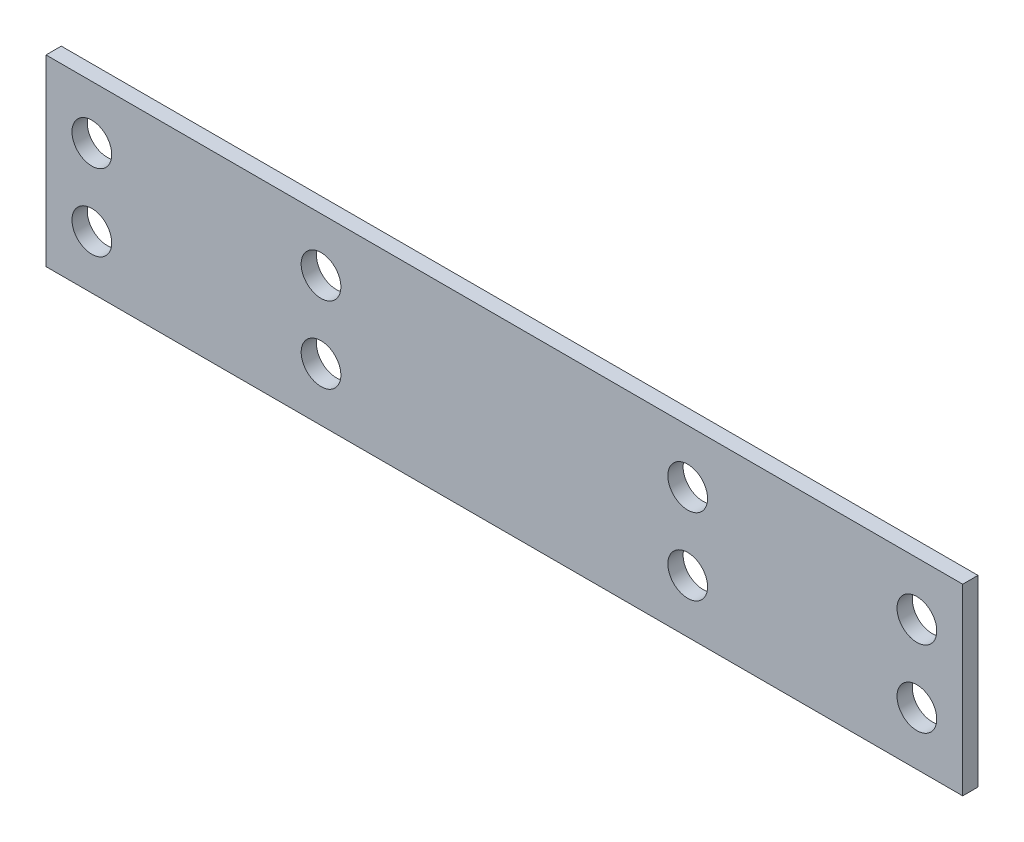
ISO-10303-21;
HEADER;
FILE_DESCRIPTION(('STEP AP214'),'2;1');
FILE_NAME('part.step','',(''),(''),'','','');
FILE_SCHEMA(('AUTOMOTIVE_DESIGN { 1 0 10303 214 1 1 1 1 }'));
ENDSEC;
DATA;
#1=APPLICATION_CONTEXT('core data for automotive mechanical design processes');
#2=APPLICATION_PROTOCOL_DEFINITION('international standard','automotive_design',2000,#1);
#3=PRODUCT_CONTEXT('',#1,'mechanical');
#4=PRODUCT('Part','Part','',(#3));
#5=PRODUCT_RELATED_PRODUCT_CATEGORY('part','',(#4));
#6=PRODUCT_DEFINITION_FORMATION('','',#4);
#7=PRODUCT_DEFINITION_CONTEXT('part definition',#1,'design');
#8=PRODUCT_DEFINITION('design','',#6,#7);
#9=PRODUCT_DEFINITION_SHAPE('','',#8);
#10=(LENGTH_UNIT() NAMED_UNIT(*) SI_UNIT(.MILLI.,.METRE.));
#11=(NAMED_UNIT(*) PLANE_ANGLE_UNIT() SI_UNIT($,.RADIAN.));
#12=(NAMED_UNIT(*) SI_UNIT($,.STERADIAN.) SOLID_ANGLE_UNIT());
#13=UNCERTAINTY_MEASURE_WITH_UNIT(LENGTH_MEASURE(1.E-05),#10,'distance_accuracy_value','');
#14=(GEOMETRIC_REPRESENTATION_CONTEXT(3) GLOBAL_UNCERTAINTY_ASSIGNED_CONTEXT((#13)) GLOBAL_UNIT_ASSIGNED_CONTEXT((#10,
#11,#12)) REPRESENTATION_CONTEXT('',''));
#15=CARTESIAN_POINT('',(0.,0.,0.));
#16=DIRECTION('',(0.,0.,1.));
#17=DIRECTION('',(1.,0.,0.));
#18=AXIS2_PLACEMENT_3D('',#15,#16,#17);
#19=CARTESIAN_POINT('',(300.,-60.,10.));
#20=DIRECTION('',(-1.,0.,0.));
#21=DIRECTION('',(0.,0.,1.));
#22=AXIS2_PLACEMENT_3D('',#19,#20,#21);
#23=PLANE('',#22);
#24=DIRECTION('',(0.,1.,0.));
#25=VECTOR('',#24,1.);
#26=CARTESIAN_POINT('',(300.,-60.,0.));
#27=LINE('',#26,#25);
#28=CARTESIAN_POINT('',(300.,-60.,0.));
#29=VERTEX_POINT('',#28);
#30=CARTESIAN_POINT('',(300.,60.,0.));
#31=VERTEX_POINT('',#30);
#32=EDGE_CURVE('E97',#29,#31,#27,.T.);
#33=ORIENTED_EDGE('',*,*,#32,.T.);
#34=DIRECTION('',(0.,0.,-1.));
#35=VECTOR('',#34,1.);
#36=CARTESIAN_POINT('',(300.,60.,10.));
#37=LINE('',#36,#35);
#38=CARTESIAN_POINT('',(300.,60.,10.));
#39=VERTEX_POINT('',#38);
#40=EDGE_CURVE('E11',#39,#31,#37,.T.);
#41=ORIENTED_EDGE('',*,*,#40,.F.);
#42=DIRECTION('',(0.,1.,0.));
#43=VECTOR('',#42,1.);
#44=CARTESIAN_POINT('',(300.,-60.,10.));
#45=LINE('',#44,#43);
#46=CARTESIAN_POINT('',(300.,-60.,10.));
#47=VERTEX_POINT('',#46);
#48=EDGE_CURVE('E85',#47,#39,#45,.T.);
#49=ORIENTED_EDGE('',*,*,#48,.F.);
#50=DIRECTION('',(0.,0.,-1.));
#51=VECTOR('',#50,1.);
#52=CARTESIAN_POINT('',(300.,-60.,10.));
#53=LINE('',#52,#51);
#54=EDGE_CURVE('E93',#47,#29,#53,.T.);
#55=ORIENTED_EDGE('',*,*,#54,.T.);
#56=EDGE_LOOP('',(#33,#41,#49,#55));
#57=FACE_BOUND('',#56,.T.);
#58=ADVANCED_FACE('F34',(#57),#23,.F.);
#59=CARTESIAN_POINT('',(-300.,60.,10.));
#60=DIRECTION('',(0.,-1.,0.));
#61=DIRECTION('',(0.,0.,-1.));
#62=AXIS2_PLACEMENT_3D('',#59,#60,#61);
#63=PLANE('',#62);
#64=DIRECTION('',(-1.,0.,0.));
#65=VECTOR('',#64,1.);
#66=CARTESIAN_POINT('',(-300.,60.,0.));
#67=LINE('',#66,#65);
#68=CARTESIAN_POINT('',(-300.,60.,0.));
#69=VERTEX_POINT('',#68);
#70=EDGE_CURVE('E89',#31,#69,#67,.T.);
#71=ORIENTED_EDGE('',*,*,#70,.T.);
#72=DIRECTION('',(0.,0.,-1.));
#73=VECTOR('',#72,1.);
#74=CARTESIAN_POINT('',(-300.,60.,10.));
#75=LINE('',#74,#73);
#76=CARTESIAN_POINT('',(-300.,60.,10.));
#77=VERTEX_POINT('',#76);
#78=EDGE_CURVE('E42',#77,#69,#75,.T.);
#79=ORIENTED_EDGE('',*,*,#78,.F.);
#80=DIRECTION('',(-1.,0.,0.));
#81=VECTOR('',#80,1.);
#82=CARTESIAN_POINT('',(-300.,60.,10.));
#83=LINE('',#82,#81);
#84=EDGE_CURVE('E80',#39,#77,#83,.T.);
#85=ORIENTED_EDGE('',*,*,#84,.F.);
#86=ORIENTED_EDGE('',*,*,#40,.T.);
#87=EDGE_LOOP('',(#71,#79,#85,#86));
#88=FACE_BOUND('',#87,.T.);
#89=ADVANCED_FACE('F88',(#88),#63,.F.);
#90=CARTESIAN_POINT('',(-300.,-60.,10.));
#91=DIRECTION('',(1.,0.,0.));
#92=DIRECTION('',(0.,0.,-1.));
#93=AXIS2_PLACEMENT_3D('',#90,#91,#92);
#94=PLANE('',#93);
#95=DIRECTION('',(0.,-1.,0.));
#96=VECTOR('',#95,1.);
#97=CARTESIAN_POINT('',(-300.,-60.,0.));
#98=LINE('',#97,#96);
#99=CARTESIAN_POINT('',(-300.,-60.,0.));
#100=VERTEX_POINT('',#99);
#101=EDGE_CURVE('E67',#69,#100,#98,.T.);
#102=ORIENTED_EDGE('',*,*,#101,.T.);
#103=DIRECTION('',(0.,0.,-1.));
#104=VECTOR('',#103,1.);
#105=CARTESIAN_POINT('',(-300.,-60.,10.));
#106=LINE('',#105,#104);
#107=CARTESIAN_POINT('',(-300.,-60.,10.));
#108=VERTEX_POINT('',#107);
#109=EDGE_CURVE('E90',#108,#100,#106,.T.);
#110=ORIENTED_EDGE('',*,*,#109,.F.);
#111=DIRECTION('',(0.,-1.,0.));
#112=VECTOR('',#111,1.);
#113=CARTESIAN_POINT('',(-300.,-60.,10.));
#114=LINE('',#113,#112);
#115=EDGE_CURVE('E83',#77,#108,#114,.T.);
#116=ORIENTED_EDGE('',*,*,#115,.F.);
#117=ORIENTED_EDGE('',*,*,#78,.T.);
#118=EDGE_LOOP('',(#102,#110,#116,#117));
#119=FACE_BOUND('',#118,.T.);
#120=ADVANCED_FACE('F91',(#119),#94,.F.);
#121=CARTESIAN_POINT('',(-300.,-60.,10.));
#122=DIRECTION('',(0.,1.,0.));
#123=DIRECTION('',(0.,0.,1.));
#124=AXIS2_PLACEMENT_3D('',#121,#122,#123);
#125=PLANE('',#124);
#126=DIRECTION('',(1.,0.,0.));
#127=VECTOR('',#126,1.);
#128=CARTESIAN_POINT('',(-300.,-60.,0.));
#129=LINE('',#128,#127);
#130=EDGE_CURVE('E73',#100,#29,#129,.T.);
#131=ORIENTED_EDGE('',*,*,#130,.T.);
#132=ORIENTED_EDGE('',*,*,#54,.F.);
#133=DIRECTION('',(1.,0.,0.));
#134=VECTOR('',#133,1.);
#135=CARTESIAN_POINT('',(-300.,-60.,10.));
#136=LINE('',#135,#134);
#137=EDGE_CURVE('E50',#108,#47,#136,.T.);
#138=ORIENTED_EDGE('',*,*,#137,.F.);
#139=ORIENTED_EDGE('',*,*,#109,.T.);
#140=EDGE_LOOP('',(#131,#132,#138,#139));
#141=FACE_BOUND('',#140,.T.);
#142=ADVANCED_FACE('F105',(#141),#125,.F.);
#143=CARTESIAN_POINT('',(0.,0.,0.));
#144=DIRECTION('',(0.,0.,-1.));
#145=DIRECTION('',(-1.,0.,0.));
#146=AXIS2_PLACEMENT_3D('',#143,#144,#145);
#147=PLANE('',#146);
#148=CARTESIAN_POINT('',(-270.,25.,0.));
#149=DIRECTION('',(0.,0.,-1.));
#150=DIRECTION('',(-1.,0.,0.));
#151=AXIS2_PLACEMENT_3D('',#148,#149,#150);
#152=CIRCLE('',#151,13.);
#153=CARTESIAN_POINT('',(-283.,25.,0.));
#154=VERTEX_POINT('',#153);
#155=EDGE_CURVE('E134',#154,#154,#152,.T.);
#156=ORIENTED_EDGE('',*,*,#155,.F.);
#157=EDGE_LOOP('',(#156));
#158=FACE_BOUND('',#157,.T.);
#159=CARTESIAN_POINT('',(-270.,-25.,0.));
#160=DIRECTION('',(0.,0.,-1.));
#161=DIRECTION('',(-1.,0.,0.));
#162=AXIS2_PLACEMENT_3D('',#159,#160,#161);
#163=CIRCLE('',#162,13.);
#164=CARTESIAN_POINT('',(-283.,-25.,0.));
#165=VERTEX_POINT('',#164);
#166=EDGE_CURVE('E153',#165,#165,#163,.T.);
#167=ORIENTED_EDGE('',*,*,#166,.F.);
#168=EDGE_LOOP('',(#167));
#169=FACE_BOUND('',#168,.T.);
#170=CARTESIAN_POINT('',(-120.,25.,0.));
#171=DIRECTION('',(0.,0.,-1.));
#172=DIRECTION('',(-1.,0.,0.));
#173=AXIS2_PLACEMENT_3D('',#170,#171,#172);
#174=CIRCLE('',#173,13.);
#175=CARTESIAN_POINT('',(-133.,25.,0.));
#176=VERTEX_POINT('',#175);
#177=EDGE_CURVE('E150',#176,#176,#174,.T.);
#178=ORIENTED_EDGE('',*,*,#177,.F.);
#179=EDGE_LOOP('',(#178));
#180=FACE_BOUND('',#179,.T.);
#181=CARTESIAN_POINT('',(-120.,-25.,0.));
#182=DIRECTION('',(0.,0.,-1.));
#183=DIRECTION('',(-1.,0.,0.));
#184=AXIS2_PLACEMENT_3D('',#181,#182,#183);
#185=CIRCLE('',#184,13.);
#186=CARTESIAN_POINT('',(-133.,-25.,0.));
#187=VERTEX_POINT('',#186);
#188=EDGE_CURVE('E147',#187,#187,#185,.T.);
#189=ORIENTED_EDGE('',*,*,#188,.F.);
#190=EDGE_LOOP('',(#189));
#191=FACE_BOUND('',#190,.T.);
#192=CARTESIAN_POINT('',(120.,-25.,0.));
#193=DIRECTION('',(0.,0.,-1.));
#194=DIRECTION('',(1.,0.,0.));
#195=AXIS2_PLACEMENT_3D('',#192,#193,#194);
#196=CIRCLE('',#195,13.);
#197=CARTESIAN_POINT('',(133.,-25.,0.));
#198=VERTEX_POINT('',#197);
#199=EDGE_CURVE('E144',#198,#198,#196,.T.);
#200=ORIENTED_EDGE('',*,*,#199,.F.);
#201=EDGE_LOOP('',(#200));
#202=FACE_BOUND('',#201,.T.);
#203=CARTESIAN_POINT('',(120.,25.,0.));
#204=DIRECTION('',(0.,0.,-1.));
#205=DIRECTION('',(1.,0.,0.));
#206=AXIS2_PLACEMENT_3D('',#203,#204,#205);
#207=CIRCLE('',#206,13.);
#208=CARTESIAN_POINT('',(133.,25.,0.));
#209=VERTEX_POINT('',#208);
#210=EDGE_CURVE('E141',#209,#209,#207,.T.);
#211=ORIENTED_EDGE('',*,*,#210,.F.);
#212=EDGE_LOOP('',(#211));
#213=FACE_BOUND('',#212,.T.);
#214=CARTESIAN_POINT('',(270.,-25.,0.));
#215=DIRECTION('',(0.,0.,-1.));
#216=DIRECTION('',(1.,0.,0.));
#217=AXIS2_PLACEMENT_3D('',#214,#215,#216);
#218=CIRCLE('',#217,13.);
#219=CARTESIAN_POINT('',(283.,-25.,0.));
#220=VERTEX_POINT('',#219);
#221=EDGE_CURVE('E138',#220,#220,#218,.T.);
#222=ORIENTED_EDGE('',*,*,#221,.F.);
#223=EDGE_LOOP('',(#222));
#224=FACE_BOUND('',#223,.T.);
#225=CARTESIAN_POINT('',(270.,25.,0.));
#226=DIRECTION('',(0.,0.,-1.));
#227=DIRECTION('',(1.,0.,0.));
#228=AXIS2_PLACEMENT_3D('',#225,#226,#227);
#229=CIRCLE('',#228,13.);
#230=CARTESIAN_POINT('',(283.,25.,0.));
#231=VERTEX_POINT('',#230);
#232=EDGE_CURVE('E135',#231,#231,#229,.T.);
#233=ORIENTED_EDGE('',*,*,#232,.F.);
#234=EDGE_LOOP('',(#233));
#235=FACE_BOUND('',#234,.T.);
#236=ORIENTED_EDGE('',*,*,#32,.F.);
#237=ORIENTED_EDGE('',*,*,#130,.F.);
#238=ORIENTED_EDGE('',*,*,#101,.F.);
#239=ORIENTED_EDGE('',*,*,#70,.F.);
#240=EDGE_LOOP('',(#236,#237,#238,#239));
#241=FACE_BOUND('',#240,.T.);
#242=ADVANCED_FACE('F108',(#158,#169,#180,#191,#202,#213,#224,#235,#241),#147,.T.);
#243=CARTESIAN_POINT('',(270.,25.,6370.));
#244=DIRECTION('',(0.,0.,-1.));
#245=DIRECTION('',(-1.,0.,0.));
#246=AXIS2_PLACEMENT_3D('',#243,#244,#245);
#247=CYLINDRICAL_SURFACE('',#246,13.);
#248=ORIENTED_EDGE('',*,*,#232,.T.);
#249=EDGE_LOOP('',(#248));
#250=FACE_BOUND('',#249,.T.);
#251=CARTESIAN_POINT('',(270.,25.,9.99999999999979));
#252=DIRECTION('',(0.,0.,-1.));
#253=DIRECTION('',(-1.,0.,0.));
#254=AXIS2_PLACEMENT_3D('',#251,#252,#253);
#255=CIRCLE('',#254,13.);
#256=CARTESIAN_POINT('',(257.,25.,9.99999999999979));
#257=VERTEX_POINT('',#256);
#258=EDGE_CURVE('E131',#257,#257,#255,.T.);
#259=ORIENTED_EDGE('',*,*,#258,.F.);
#260=EDGE_LOOP('',(#259));
#261=FACE_BOUND('',#260,.T.);
#262=ADVANCED_FACE('F164',(#250,#261),#247,.F.);
#263=CARTESIAN_POINT('',(270.,-25.,6370.));
#264=DIRECTION('',(0.,0.,-1.));
#265=DIRECTION('',(-1.,0.,0.));
#266=AXIS2_PLACEMENT_3D('',#263,#264,#265);
#267=CYLINDRICAL_SURFACE('',#266,13.);
#268=ORIENTED_EDGE('',*,*,#221,.T.);
#269=EDGE_LOOP('',(#268));
#270=FACE_BOUND('',#269,.T.);
#271=CARTESIAN_POINT('',(270.,-25.,9.99999999999979));
#272=DIRECTION('',(0.,0.,-1.));
#273=DIRECTION('',(-1.,0.,0.));
#274=AXIS2_PLACEMENT_3D('',#271,#272,#273);
#275=CIRCLE('',#274,13.);
#276=CARTESIAN_POINT('',(257.,-25.,9.99999999999979));
#277=VERTEX_POINT('',#276);
#278=EDGE_CURVE('E128',#277,#277,#275,.T.);
#279=ORIENTED_EDGE('',*,*,#278,.F.);
#280=EDGE_LOOP('',(#279));
#281=FACE_BOUND('',#280,.T.);
#282=ADVANCED_FACE('F182',(#270,#281),#267,.F.);
#283=CARTESIAN_POINT('',(120.,25.,6370.));
#284=DIRECTION('',(0.,0.,-1.));
#285=DIRECTION('',(-1.,0.,0.));
#286=AXIS2_PLACEMENT_3D('',#283,#284,#285);
#287=CYLINDRICAL_SURFACE('',#286,13.);
#288=ORIENTED_EDGE('',*,*,#210,.T.);
#289=EDGE_LOOP('',(#288));
#290=FACE_BOUND('',#289,.T.);
#291=CARTESIAN_POINT('',(120.,25.,9.99999999999979));
#292=DIRECTION('',(0.,0.,-1.));
#293=DIRECTION('',(-1.,0.,0.));
#294=AXIS2_PLACEMENT_3D('',#291,#292,#293);
#295=CIRCLE('',#294,13.);
#296=CARTESIAN_POINT('',(107.,25.,9.99999999999979));
#297=VERTEX_POINT('',#296);
#298=EDGE_CURVE('E125',#297,#297,#295,.T.);
#299=ORIENTED_EDGE('',*,*,#298,.F.);
#300=EDGE_LOOP('',(#299));
#301=FACE_BOUND('',#300,.T.);
#302=ADVANCED_FACE('F224',(#290,#301),#287,.F.);
#303=CARTESIAN_POINT('',(120.,-25.,6370.));
#304=DIRECTION('',(0.,0.,-1.));
#305=DIRECTION('',(-1.,0.,0.));
#306=AXIS2_PLACEMENT_3D('',#303,#304,#305);
#307=CYLINDRICAL_SURFACE('',#306,13.);
#308=ORIENTED_EDGE('',*,*,#199,.T.);
#309=EDGE_LOOP('',(#308));
#310=FACE_BOUND('',#309,.T.);
#311=CARTESIAN_POINT('',(120.,-25.,9.99999999999979));
#312=DIRECTION('',(0.,0.,-1.));
#313=DIRECTION('',(-1.,0.,0.));
#314=AXIS2_PLACEMENT_3D('',#311,#312,#313);
#315=CIRCLE('',#314,13.);
#316=CARTESIAN_POINT('',(107.,-25.,9.99999999999979));
#317=VERTEX_POINT('',#316);
#318=EDGE_CURVE('E122',#317,#317,#315,.T.);
#319=ORIENTED_EDGE('',*,*,#318,.F.);
#320=EDGE_LOOP('',(#319));
#321=FACE_BOUND('',#320,.T.);
#322=ADVANCED_FACE('F232',(#310,#321),#307,.F.);
#323=CARTESIAN_POINT('',(-120.,-25.,6370.));
#324=DIRECTION('',(0.,0.,-1.));
#325=DIRECTION('',(-1.,0.,0.));
#326=AXIS2_PLACEMENT_3D('',#323,#324,#325);
#327=CYLINDRICAL_SURFACE('',#326,13.);
#328=ORIENTED_EDGE('',*,*,#188,.T.);
#329=EDGE_LOOP('',(#328));
#330=FACE_BOUND('',#329,.T.);
#331=CARTESIAN_POINT('',(-120.,-25.,9.99999999999979));
#332=DIRECTION('',(0.,0.,-1.));
#333=DIRECTION('',(-1.,0.,0.));
#334=AXIS2_PLACEMENT_3D('',#331,#332,#333);
#335=CIRCLE('',#334,13.);
#336=CARTESIAN_POINT('',(-133.,-25.,9.99999999999979));
#337=VERTEX_POINT('',#336);
#338=EDGE_CURVE('E119',#337,#337,#335,.T.);
#339=ORIENTED_EDGE('',*,*,#338,.F.);
#340=EDGE_LOOP('',(#339));
#341=FACE_BOUND('',#340,.T.);
#342=ADVANCED_FACE('F240',(#330,#341),#327,.F.);
#343=CARTESIAN_POINT('',(-120.,25.,6370.));
#344=DIRECTION('',(0.,0.,-1.));
#345=DIRECTION('',(-1.,0.,0.));
#346=AXIS2_PLACEMENT_3D('',#343,#344,#345);
#347=CYLINDRICAL_SURFACE('',#346,13.);
#348=ORIENTED_EDGE('',*,*,#177,.T.);
#349=EDGE_LOOP('',(#348));
#350=FACE_BOUND('',#349,.T.);
#351=CARTESIAN_POINT('',(-120.,25.,9.99999999999979));
#352=DIRECTION('',(0.,0.,-1.));
#353=DIRECTION('',(-1.,0.,0.));
#354=AXIS2_PLACEMENT_3D('',#351,#352,#353);
#355=CIRCLE('',#354,13.);
#356=CARTESIAN_POINT('',(-133.,25.,9.99999999999979));
#357=VERTEX_POINT('',#356);
#358=EDGE_CURVE('E116',#357,#357,#355,.T.);
#359=ORIENTED_EDGE('',*,*,#358,.F.);
#360=EDGE_LOOP('',(#359));
#361=FACE_BOUND('',#360,.T.);
#362=ADVANCED_FACE('F248',(#350,#361),#347,.F.);
#363=CARTESIAN_POINT('',(-270.,-25.,6370.));
#364=DIRECTION('',(0.,0.,-1.));
#365=DIRECTION('',(-1.,0.,0.));
#366=AXIS2_PLACEMENT_3D('',#363,#364,#365);
#367=CYLINDRICAL_SURFACE('',#366,13.);
#368=ORIENTED_EDGE('',*,*,#166,.T.);
#369=EDGE_LOOP('',(#368));
#370=FACE_BOUND('',#369,.T.);
#371=CARTESIAN_POINT('',(-270.,-25.,9.99999999999979));
#372=DIRECTION('',(0.,0.,-1.));
#373=DIRECTION('',(-1.,0.,0.));
#374=AXIS2_PLACEMENT_3D('',#371,#372,#373);
#375=CIRCLE('',#374,13.);
#376=CARTESIAN_POINT('',(-283.,-25.,9.99999999999979));
#377=VERTEX_POINT('',#376);
#378=EDGE_CURVE('E113',#377,#377,#375,.T.);
#379=ORIENTED_EDGE('',*,*,#378,.F.);
#380=EDGE_LOOP('',(#379));
#381=FACE_BOUND('',#380,.T.);
#382=ADVANCED_FACE('F192',(#370,#381),#367,.F.);
#383=CARTESIAN_POINT('',(-270.,25.,6370.));
#384=DIRECTION('',(0.,0.,-1.));
#385=DIRECTION('',(-1.,0.,0.));
#386=AXIS2_PLACEMENT_3D('',#383,#384,#385);
#387=CYLINDRICAL_SURFACE('',#386,13.);
#388=ORIENTED_EDGE('',*,*,#155,.T.);
#389=EDGE_LOOP('',(#388));
#390=FACE_BOUND('',#389,.T.);
#391=CARTESIAN_POINT('',(-270.,25.,9.99999999999979));
#392=DIRECTION('',(0.,0.,-1.));
#393=DIRECTION('',(-1.,0.,0.));
#394=AXIS2_PLACEMENT_3D('',#391,#392,#393);
#395=CIRCLE('',#394,13.);
#396=CARTESIAN_POINT('',(-283.,25.,9.99999999999979));
#397=VERTEX_POINT('',#396);
#398=EDGE_CURVE('E100',#397,#397,#395,.T.);
#399=ORIENTED_EDGE('',*,*,#398,.F.);
#400=EDGE_LOOP('',(#399));
#401=FACE_BOUND('',#400,.T.);
#402=ADVANCED_FACE('F159',(#390,#401),#387,.F.);
#403=CARTESIAN_POINT('',(0.,0.,10.));
#404=DIRECTION('',(0.,0.,-1.));
#405=DIRECTION('',(-1.,0.,0.));
#406=AXIS2_PLACEMENT_3D('',#403,#404,#405);
#407=PLANE('',#406);
#408=ORIENTED_EDGE('',*,*,#398,.T.);
#409=EDGE_LOOP('',(#408));
#410=FACE_BOUND('',#409,.T.);
#411=ORIENTED_EDGE('',*,*,#378,.T.);
#412=EDGE_LOOP('',(#411));
#413=FACE_BOUND('',#412,.T.);
#414=ORIENTED_EDGE('',*,*,#358,.T.);
#415=EDGE_LOOP('',(#414));
#416=FACE_BOUND('',#415,.T.);
#417=ORIENTED_EDGE('',*,*,#338,.T.);
#418=EDGE_LOOP('',(#417));
#419=FACE_BOUND('',#418,.T.);
#420=ORIENTED_EDGE('',*,*,#318,.T.);
#421=EDGE_LOOP('',(#420));
#422=FACE_BOUND('',#421,.T.);
#423=ORIENTED_EDGE('',*,*,#298,.T.);
#424=EDGE_LOOP('',(#423));
#425=FACE_BOUND('',#424,.T.);
#426=ORIENTED_EDGE('',*,*,#278,.T.);
#427=EDGE_LOOP('',(#426));
#428=FACE_BOUND('',#427,.T.);
#429=ORIENTED_EDGE('',*,*,#258,.T.);
#430=EDGE_LOOP('',(#429));
#431=FACE_BOUND('',#430,.T.);
#432=ORIENTED_EDGE('',*,*,#48,.T.);
#433=ORIENTED_EDGE('',*,*,#84,.T.);
#434=ORIENTED_EDGE('',*,*,#115,.T.);
#435=ORIENTED_EDGE('',*,*,#137,.T.);
#436=EDGE_LOOP('',(#432,#433,#434,#435));
#437=FACE_BOUND('',#436,.T.);
#438=ADVANCED_FACE('F81',(#410,#413,#416,#419,#422,#425,#428,#431,#437),#407,.F.);
#439=CLOSED_SHELL('',(#58,#89,#120,#142,#242,#262,#282,#302,#322,#342,#362,#382,#402,#438));
#440=MANIFOLD_SOLID_BREP('B2',#439);
#441=ADVANCED_BREP_SHAPE_REPRESENTATION('',(#18,#440),#14);
#442=SHAPE_DEFINITION_REPRESENTATION(#9,#441);
ENDSEC;
END-ISO-10303-21;
